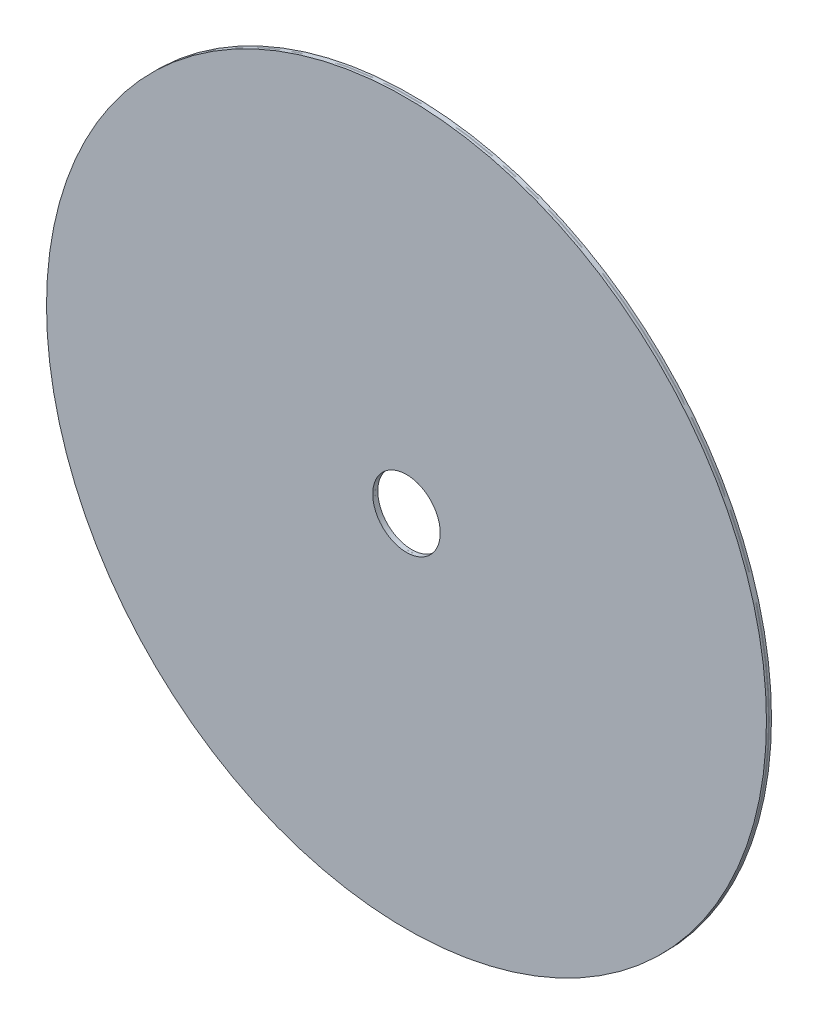
ISO-10303-21;
HEADER;
FILE_DESCRIPTION(('STEP AP214'),'2;1');
FILE_NAME('part.step','',(''),(''),'','','');
FILE_SCHEMA(('AUTOMOTIVE_DESIGN { 1 0 10303 214 1 1 1 1 }'));
ENDSEC;
DATA;
#1=APPLICATION_CONTEXT('core data for automotive mechanical design processes');
#2=APPLICATION_PROTOCOL_DEFINITION('international standard','automotive_design',2000,#1);
#3=PRODUCT_CONTEXT('',#1,'mechanical');
#4=PRODUCT('Part','Part','',(#3));
#5=PRODUCT_RELATED_PRODUCT_CATEGORY('part','',(#4));
#6=PRODUCT_DEFINITION_FORMATION('','',#4);
#7=PRODUCT_DEFINITION_CONTEXT('part definition',#1,'design');
#8=PRODUCT_DEFINITION('design','',#6,#7);
#9=PRODUCT_DEFINITION_SHAPE('','',#8);
#10=(LENGTH_UNIT() NAMED_UNIT(*) SI_UNIT(.MILLI.,.METRE.));
#11=(NAMED_UNIT(*) PLANE_ANGLE_UNIT() SI_UNIT($,.RADIAN.));
#12=(NAMED_UNIT(*) SI_UNIT($,.STERADIAN.) SOLID_ANGLE_UNIT());
#13=UNCERTAINTY_MEASURE_WITH_UNIT(LENGTH_MEASURE(1.E-05),#10,'distance_accuracy_value','');
#14=(GEOMETRIC_REPRESENTATION_CONTEXT(3) GLOBAL_UNCERTAINTY_ASSIGNED_CONTEXT((#13)) GLOBAL_UNIT_ASSIGNED_CONTEXT((#10,
#11,#12)) REPRESENTATION_CONTEXT('',''));
#15=CARTESIAN_POINT('',(0.,0.,0.));
#16=DIRECTION('',(0.,0.,1.));
#17=DIRECTION('',(1.,0.,0.));
#18=AXIS2_PLACEMENT_3D('',#15,#16,#17);
#19=CARTESIAN_POINT('',(0.,0.,0.0127));
#20=DIRECTION('',(0.,0.,-1.));
#21=DIRECTION('',(-1.,0.,0.));
#22=AXIS2_PLACEMENT_3D('',#19,#20,#21);
#23=CYLINDRICAL_SURFACE('',#22,1.190625);
#24=CARTESIAN_POINT('',(0.,0.,-0.0127));
#25=DIRECTION('',(0.,0.,1.));
#26=DIRECTION('',(1.,0.,0.));
#27=AXIS2_PLACEMENT_3D('',#24,#25,#26);
#28=CIRCLE('',#27,1.190625);
#29=CARTESIAN_POINT('',(1.17770059824204,-0.174954827099316,-0.0127));
#30=VERTEX_POINT('',#29);
#31=CARTESIAN_POINT('',(1.17802245917716,0.172774350814024,-0.0127));
#32=VERTEX_POINT('',#31);
#33=EDGE_CURVE('E236',#30,#32,#28,.T.);
#34=ORIENTED_EDGE('',*,*,#33,.F.);
#35=DIRECTION('',(0.,0.,-1.));
#36=VECTOR('',#35,1.);
#37=CARTESIAN_POINT('',(1.17770059824204,-0.174954827099316,0.0127));
#38=LINE('',#37,#36);
#39=CARTESIAN_POINT('',(1.17770059824204,-0.174954827099316,0.0127));
#40=VERTEX_POINT('',#39);
#41=EDGE_CURVE('E13',#40,#30,#38,.T.);
#42=ORIENTED_EDGE('',*,*,#41,.F.);
#43=CARTESIAN_POINT('',(0.,0.,0.0127));
#44=DIRECTION('',(0.,0.,1.));
#45=DIRECTION('',(1.,0.,0.));
#46=AXIS2_PLACEMENT_3D('',#43,#44,#45);
#47=CIRCLE('',#46,1.190625);
#48=CARTESIAN_POINT('',(1.17802245917716,0.172774350814024,0.0127));
#49=VERTEX_POINT('',#48);
#50=EDGE_CURVE('E228',#40,#49,#47,.T.);
#51=ORIENTED_EDGE('',*,*,#50,.T.);
#52=DIRECTION('',(0.,0.,-1.));
#53=VECTOR('',#52,1.);
#54=CARTESIAN_POINT('',(1.17802245917716,0.172774350814024,0.0127));
#55=LINE('',#54,#53);
#56=EDGE_CURVE('E189',#49,#32,#55,.T.);
#57=ORIENTED_EDGE('',*,*,#56,.T.);
#58=EDGE_LOOP('',(#34,#42,#51,#57));
#59=FACE_BOUND('',#58,.T.);
#60=ADVANCED_FACE('F173',(#59),#23,.F.);
#61=CARTESIAN_POINT('',(0.,-0.174954827099316,0.0127));
#62=DIRECTION('',(0.,-1.,0.));
#63=DIRECTION('',(1.,0.,0.));
#64=AXIS2_PLACEMENT_3D('',#61,#62,#63);
#65=PLANE('',#64);
#66=DIRECTION('',(-1.,0.,0.));
#67=VECTOR('',#66,1.);
#68=CARTESIAN_POINT('',(0.,-0.174954827099316,-0.0127));
#69=LINE('',#68,#67);
#70=CARTESIAN_POINT('',(3.69269610432094,-0.174954827099315,-0.0127));
#71=VERTEX_POINT('',#70);
#72=EDGE_CURVE('E219',#71,#30,#69,.T.);
#73=ORIENTED_EDGE('',*,*,#72,.F.);
#74=DIRECTION('',(0.,0.,-1.));
#75=VECTOR('',#74,1.);
#76=CARTESIAN_POINT('',(3.69269610432094,-0.174954827099315,0.0127));
#77=LINE('',#76,#75);
#78=CARTESIAN_POINT('',(3.69269610432094,-0.174954827099315,0.0127));
#79=VERTEX_POINT('',#78);
#80=EDGE_CURVE('E181',#79,#71,#77,.T.);
#81=ORIENTED_EDGE('',*,*,#80,.F.);
#82=DIRECTION('',(-1.,0.,0.));
#83=VECTOR('',#82,1.);
#84=CARTESIAN_POINT('',(0.,-0.174954827099316,0.0127));
#85=LINE('',#84,#83);
#86=EDGE_CURVE('E217',#79,#40,#85,.T.);
#87=ORIENTED_EDGE('',*,*,#86,.T.);
#88=ORIENTED_EDGE('',*,*,#41,.T.);
#89=EDGE_LOOP('',(#73,#81,#87,#88));
#90=FACE_BOUND('',#89,.T.);
#91=ADVANCED_FACE('F216',(#90),#65,.T.);
#92=CARTESIAN_POINT('',(3.69269610432094,0.,0.0127));
#93=DIRECTION('',(1.,0.,0.));
#94=DIRECTION('',(0.,0.,-1.));
#95=AXIS2_PLACEMENT_3D('',#92,#93,#94);
#96=PLANE('',#95);
#97=DIRECTION('',(0.,-1.,0.));
#98=VECTOR('',#97,1.);
#99=CARTESIAN_POINT('',(3.69269610432094,0.,-0.0127));
#100=LINE('',#99,#98);
#101=CARTESIAN_POINT('',(3.69269610432094,0.172774350814025,-0.0127));
#102=VERTEX_POINT('',#101);
#103=EDGE_CURVE('E239',#102,#71,#100,.T.);
#104=ORIENTED_EDGE('',*,*,#103,.F.);
#105=DIRECTION('',(0.,0.,-1.));
#106=VECTOR('',#105,1.);
#107=CARTESIAN_POINT('',(3.69269610432094,0.172774350814025,0.0127));
#108=LINE('',#107,#106);
#109=CARTESIAN_POINT('',(3.69269610432094,0.172774350814025,0.0127));
#110=VERTEX_POINT('',#109);
#111=EDGE_CURVE('E202',#110,#102,#108,.T.);
#112=ORIENTED_EDGE('',*,*,#111,.F.);
#113=DIRECTION('',(0.,-1.,0.));
#114=VECTOR('',#113,1.);
#115=CARTESIAN_POINT('',(3.69269610432094,0.,0.0127));
#116=LINE('',#115,#114);
#117=EDGE_CURVE('E227',#110,#79,#116,.T.);
#118=ORIENTED_EDGE('',*,*,#117,.T.);
#119=ORIENTED_EDGE('',*,*,#80,.T.);
#120=EDGE_LOOP('',(#104,#112,#118,#119));
#121=FACE_BOUND('',#120,.T.);
#122=ADVANCED_FACE('F230',(#121),#96,.T.);
#123=CARTESIAN_POINT('',(0.,0.172774350814024,0.0127));
#124=DIRECTION('',(0.,1.,0.));
#125=DIRECTION('',(-1.,0.,0.));
#126=AXIS2_PLACEMENT_3D('',#123,#124,#125);
#127=PLANE('',#126);
#128=DIRECTION('',(1.,0.,0.));
#129=VECTOR('',#128,1.);
#130=CARTESIAN_POINT('',(0.,0.172774350814024,-0.0127));
#131=LINE('',#130,#129);
#132=EDGE_CURVE('E241',#32,#102,#131,.T.);
#133=ORIENTED_EDGE('',*,*,#132,.F.);
#134=ORIENTED_EDGE('',*,*,#56,.F.);
#135=DIRECTION('',(1.,0.,0.));
#136=VECTOR('',#135,1.);
#137=CARTESIAN_POINT('',(0.,0.172774350814024,0.0127));
#138=LINE('',#137,#136);
#139=EDGE_CURVE('E231',#49,#110,#138,.T.);
#140=ORIENTED_EDGE('',*,*,#139,.T.);
#141=ORIENTED_EDGE('',*,*,#111,.T.);
#142=EDGE_LOOP('',(#133,#134,#140,#141));
#143=FACE_BOUND('',#142,.T.);
#144=ADVANCED_FACE('F246',(#143),#127,.T.);
#145=CARTESIAN_POINT('',(0.,0.,0.0127));
#146=DIRECTION('',(0.,0.,1.));
#147=DIRECTION('',(1.,0.,0.));
#148=AXIS2_PLACEMENT_3D('',#145,#146,#147);
#149=PLANE('',#148);
#150=ORIENTED_EDGE('',*,*,#50,.F.);
#151=ORIENTED_EDGE('',*,*,#86,.F.);
#152=ORIENTED_EDGE('',*,*,#117,.F.);
#153=ORIENTED_EDGE('',*,*,#139,.F.);
#154=EDGE_LOOP('',(#150,#151,#152,#153));
#155=FACE_BOUND('',#154,.T.);
#156=ADVANCED_FACE('F225',(#155),#149,.T.);
#157=CARTESIAN_POINT('',(0.,0.,-0.0127));
#158=DIRECTION('',(0.,0.,1.));
#159=DIRECTION('',(1.,0.,0.));
#160=AXIS2_PLACEMENT_3D('',#157,#158,#159);
#161=PLANE('',#160);
#162=ORIENTED_EDGE('',*,*,#33,.T.);
#163=ORIENTED_EDGE('',*,*,#132,.T.);
#164=ORIENTED_EDGE('',*,*,#103,.T.);
#165=ORIENTED_EDGE('',*,*,#72,.T.);
#166=EDGE_LOOP('',(#162,#163,#164,#165));
#167=FACE_BOUND('',#166,.T.);
#168=ADVANCED_FACE('F253',(#167),#161,.F.);
#169=CLOSED_SHELL('',(#60,#91,#122,#144,#156,#168));
#170=MANIFOLD_SOLID_BREP('B2',#169);
#171=CARTESIAN_POINT('',(0.,0.,0.0127));
#172=DIRECTION('',(0.,0.,-1.));
#173=DIRECTION('',(-1.,0.,0.));
#174=AXIS2_PLACEMENT_3D('',#171,#172,#173);
#175=CYLINDRICAL_SURFACE('',#174,1.190625);
#176=CARTESIAN_POINT('',(0.,0.,-0.0127));
#177=DIRECTION('',(0.,0.,1.));
#178=DIRECTION('',(1.,0.,0.));
#179=AXIS2_PLACEMENT_3D('',#176,#177,#178);
#180=CIRCLE('',#179,1.190625);
#181=CARTESIAN_POINT('',(-0.176045065241965,-1.17753812066912,-0.0127));
#182=VERTEX_POINT('',#181);
#183=CARTESIAN_POINT('',(0.171684112671375,-1.17818184338465,-0.0127));
#184=VERTEX_POINT('',#183);
#185=EDGE_CURVE('E369',#182,#184,#180,.T.);
#186=ORIENTED_EDGE('',*,*,#185,.F.);
#187=DIRECTION('',(0.,0.,-1.));
#188=VECTOR('',#187,1.);
#189=CARTESIAN_POINT('',(-0.176045065241965,-1.17753812066912,0.0127));
#190=LINE('',#189,#188);
#191=CARTESIAN_POINT('',(-0.176045065241965,-1.17753812066912,0.0127));
#192=VERTEX_POINT('',#191);
#193=EDGE_CURVE('E171',#192,#182,#190,.T.);
#194=ORIENTED_EDGE('',*,*,#193,.F.);
#195=CARTESIAN_POINT('',(0.,0.,0.0127));
#196=DIRECTION('',(0.,0.,1.));
#197=DIRECTION('',(1.,0.,0.));
#198=AXIS2_PLACEMENT_3D('',#195,#196,#197);
#199=CIRCLE('',#198,1.190625);
#200=CARTESIAN_POINT('',(0.171684112671375,-1.17818184338465,0.0127));
#201=VERTEX_POINT('',#200);
#202=EDGE_CURVE('E361',#192,#201,#199,.T.);
#203=ORIENTED_EDGE('',*,*,#202,.T.);
#204=DIRECTION('',(0.,0.,-1.));
#205=VECTOR('',#204,1.);
#206=CARTESIAN_POINT('',(0.171684112671375,-1.17818184338465,0.0127));
#207=LINE('',#206,#205);
#208=EDGE_CURVE('E322',#201,#184,#207,.T.);
#209=ORIENTED_EDGE('',*,*,#208,.T.);
#210=EDGE_LOOP('',(#186,#194,#203,#209));
#211=FACE_BOUND('',#210,.T.);
#212=ADVANCED_FACE('F306',(#211),#175,.F.);
#213=CARTESIAN_POINT('',(-0.176045065241965,0.,0.0127));
#214=DIRECTION('',(-1.,0.,0.));
#215=DIRECTION('',(0.,-1.,0.));
#216=AXIS2_PLACEMENT_3D('',#213,#214,#215);
#217=PLANE('',#216);
#218=DIRECTION('',(0.,1.,0.));
#219=VECTOR('',#218,1.);
#220=CARTESIAN_POINT('',(-0.176045065241965,0.,-0.0127));
#221=LINE('',#220,#219);
#222=CARTESIAN_POINT('',(-0.176045065241965,-3.69378634246359,-0.0127));
#223=VERTEX_POINT('',#222);
#224=EDGE_CURVE('E352',#223,#182,#221,.T.);
#225=ORIENTED_EDGE('',*,*,#224,.F.);
#226=DIRECTION('',(0.,0.,-1.));
#227=VECTOR('',#226,1.);
#228=CARTESIAN_POINT('',(-0.176045065241965,-3.69378634246359,0.0127));
#229=LINE('',#228,#227);
#230=CARTESIAN_POINT('',(-0.176045065241965,-3.69378634246359,0.0127));
#231=VERTEX_POINT('',#230);
#232=EDGE_CURVE('E314',#231,#223,#229,.T.);
#233=ORIENTED_EDGE('',*,*,#232,.F.);
#234=DIRECTION('',(0.,1.,0.));
#235=VECTOR('',#234,1.);
#236=CARTESIAN_POINT('',(-0.176045065241965,0.,0.0127));
#237=LINE('',#236,#235);
#238=EDGE_CURVE('E350',#231,#192,#237,.T.);
#239=ORIENTED_EDGE('',*,*,#238,.T.);
#240=ORIENTED_EDGE('',*,*,#193,.T.);
#241=EDGE_LOOP('',(#225,#233,#239,#240));
#242=FACE_BOUND('',#241,.T.);
#243=ADVANCED_FACE('F349',(#242),#217,.T.);
#244=CARTESIAN_POINT('',(0.,-3.69378634246359,0.0127));
#245=DIRECTION('',(0.,-1.,0.));
#246=DIRECTION('',(0.,0.,-1.));
#247=AXIS2_PLACEMENT_3D('',#244,#245,#246);
#248=PLANE('',#247);
#249=DIRECTION('',(-1.,0.,0.));
#250=VECTOR('',#249,1.);
#251=CARTESIAN_POINT('',(0.,-3.69378634246359,-0.0127));
#252=LINE('',#251,#250);
#253=CARTESIAN_POINT('',(0.171684112671376,-3.69378634246359,-0.0127));
#254=VERTEX_POINT('',#253);
#255=EDGE_CURVE('E372',#254,#223,#252,.T.);
#256=ORIENTED_EDGE('',*,*,#255,.F.);
#257=DIRECTION('',(0.,0.,-1.));
#258=VECTOR('',#257,1.);
#259=CARTESIAN_POINT('',(0.171684112671376,-3.69378634246359,0.0127));
#260=LINE('',#259,#258);
#261=CARTESIAN_POINT('',(0.171684112671376,-3.69378634246359,0.0127));
#262=VERTEX_POINT('',#261);
#263=EDGE_CURVE('E335',#262,#254,#260,.T.);
#264=ORIENTED_EDGE('',*,*,#263,.F.);
#265=DIRECTION('',(-1.,0.,0.));
#266=VECTOR('',#265,1.);
#267=CARTESIAN_POINT('',(0.,-3.69378634246359,0.0127));
#268=LINE('',#267,#266);
#269=EDGE_CURVE('E360',#262,#231,#268,.T.);
#270=ORIENTED_EDGE('',*,*,#269,.T.);
#271=ORIENTED_EDGE('',*,*,#232,.T.);
#272=EDGE_LOOP('',(#256,#264,#270,#271));
#273=FACE_BOUND('',#272,.T.);
#274=ADVANCED_FACE('F363',(#273),#248,.T.);
#275=CARTESIAN_POINT('',(0.171684112671374,0.,0.0127));
#276=DIRECTION('',(1.,0.,0.));
#277=DIRECTION('',(0.,1.,0.));
#278=AXIS2_PLACEMENT_3D('',#275,#276,#277);
#279=PLANE('',#278);
#280=DIRECTION('',(0.,-1.,0.));
#281=VECTOR('',#280,1.);
#282=CARTESIAN_POINT('',(0.171684112671374,0.,-0.0127));
#283=LINE('',#282,#281);
#284=EDGE_CURVE('E374',#184,#254,#283,.T.);
#285=ORIENTED_EDGE('',*,*,#284,.F.);
#286=ORIENTED_EDGE('',*,*,#208,.F.);
#287=DIRECTION('',(0.,-1.,0.));
#288=VECTOR('',#287,1.);
#289=CARTESIAN_POINT('',(0.171684112671374,0.,0.0127));
#290=LINE('',#289,#288);
#291=EDGE_CURVE('E364',#201,#262,#290,.T.);
#292=ORIENTED_EDGE('',*,*,#291,.T.);
#293=ORIENTED_EDGE('',*,*,#263,.T.);
#294=EDGE_LOOP('',(#285,#286,#292,#293));
#295=FACE_BOUND('',#294,.T.);
#296=ADVANCED_FACE('F379',(#295),#279,.T.);
#297=CARTESIAN_POINT('',(0.,0.,0.0127));
#298=DIRECTION('',(0.,0.,1.));
#299=DIRECTION('',(1.,0.,0.));
#300=AXIS2_PLACEMENT_3D('',#297,#298,#299);
#301=PLANE('',#300);
#302=ORIENTED_EDGE('',*,*,#202,.F.);
#303=ORIENTED_EDGE('',*,*,#238,.F.);
#304=ORIENTED_EDGE('',*,*,#269,.F.);
#305=ORIENTED_EDGE('',*,*,#291,.F.);
#306=EDGE_LOOP('',(#302,#303,#304,#305));
#307=FACE_BOUND('',#306,.T.);
#308=ADVANCED_FACE('F358',(#307),#301,.T.);
#309=CARTESIAN_POINT('',(0.,0.,-0.0127));
#310=DIRECTION('',(0.,0.,1.));
#311=DIRECTION('',(1.,0.,0.));
#312=AXIS2_PLACEMENT_3D('',#309,#310,#311);
#313=PLANE('',#312);
#314=ORIENTED_EDGE('',*,*,#185,.T.);
#315=ORIENTED_EDGE('',*,*,#284,.T.);
#316=ORIENTED_EDGE('',*,*,#255,.T.);
#317=ORIENTED_EDGE('',*,*,#224,.T.);
#318=EDGE_LOOP('',(#314,#315,#316,#317));
#319=FACE_BOUND('',#318,.T.);
#320=ADVANCED_FACE('F386',(#319),#313,.F.);
#321=CLOSED_SHELL('',(#212,#243,#274,#296,#308,#320));
#322=MANIFOLD_SOLID_BREP('B7',#321);
#323=CARTESIAN_POINT('',(0.,3.69378634246359,0.0127));
#324=DIRECTION('',(0.,1.,0.));
#325=DIRECTION('',(0.,0.,1.));
#326=AXIS2_PLACEMENT_3D('',#323,#324,#325);
#327=PLANE('',#326);
#328=DIRECTION('',(1.,0.,0.));
#329=VECTOR('',#328,1.);
#330=CARTESIAN_POINT('',(0.,3.69378634246359,-0.0127));
#331=LINE('',#330,#329);
#332=CARTESIAN_POINT('',(-0.17386458895667,3.69378634246359,-0.0127));
#333=VERTEX_POINT('',#332);
#334=CARTESIAN_POINT('',(0.17386458895667,3.69378634246359,-0.0127));
#335=VERTEX_POINT('',#334);
#336=EDGE_CURVE('E502',#333,#335,#331,.T.);
#337=ORIENTED_EDGE('',*,*,#336,.F.);
#338=DIRECTION('',(0.,0.,-1.));
#339=VECTOR('',#338,1.);
#340=CARTESIAN_POINT('',(-0.17386458895667,3.69378634246359,0.0127));
#341=LINE('',#340,#339);
#342=CARTESIAN_POINT('',(-0.17386458895667,3.69378634246359,0.0127));
#343=VERTEX_POINT('',#342);
#344=EDGE_CURVE('E304',#343,#333,#341,.T.);
#345=ORIENTED_EDGE('',*,*,#344,.F.);
#346=DIRECTION('',(1.,0.,0.));
#347=VECTOR('',#346,1.);
#348=CARTESIAN_POINT('',(0.,3.69378634246359,0.0127));
#349=LINE('',#348,#347);
#350=CARTESIAN_POINT('',(0.17386458895667,3.69378634246359,0.0127));
#351=VERTEX_POINT('',#350);
#352=EDGE_CURVE('E494',#343,#351,#349,.T.);
#353=ORIENTED_EDGE('',*,*,#352,.T.);
#354=DIRECTION('',(0.,0.,-1.));
#355=VECTOR('',#354,1.);
#356=CARTESIAN_POINT('',(0.17386458895667,3.69378634246359,0.0127));
#357=LINE('',#356,#355);
#358=EDGE_CURVE('E455',#351,#335,#357,.T.);
#359=ORIENTED_EDGE('',*,*,#358,.T.);
#360=EDGE_LOOP('',(#337,#345,#353,#359));
#361=FACE_BOUND('',#360,.T.);
#362=ADVANCED_FACE('F439',(#361),#327,.T.);
#363=CARTESIAN_POINT('',(-0.173864588956669,0.,0.0127));
#364=DIRECTION('',(-1.,0.,0.));
#365=DIRECTION('',(0.,-1.,0.));
#366=AXIS2_PLACEMENT_3D('',#363,#364,#365);
#367=PLANE('',#366);
#368=DIRECTION('',(0.,1.,0.));
#369=VECTOR('',#368,1.);
#370=CARTESIAN_POINT('',(-0.173864588956669,0.,-0.0127));
#371=LINE('',#370,#369);
#372=CARTESIAN_POINT('',(-0.173864588956669,1.17786204427001,-0.0127));
#373=VERTEX_POINT('',#372);
#374=EDGE_CURVE('E485',#373,#333,#371,.T.);
#375=ORIENTED_EDGE('',*,*,#374,.F.);
#376=DIRECTION('',(0.,0.,-1.));
#377=VECTOR('',#376,1.);
#378=CARTESIAN_POINT('',(-0.173864588956669,1.17786204427001,0.0127));
#379=LINE('',#378,#377);
#380=CARTESIAN_POINT('',(-0.173864588956669,1.17786204427001,0.0127));
#381=VERTEX_POINT('',#380);
#382=EDGE_CURVE('E447',#381,#373,#379,.T.);
#383=ORIENTED_EDGE('',*,*,#382,.F.);
#384=DIRECTION('',(0.,1.,0.));
#385=VECTOR('',#384,1.);
#386=CARTESIAN_POINT('',(-0.173864588956669,0.,0.0127));
#387=LINE('',#386,#385);
#388=EDGE_CURVE('E483',#381,#343,#387,.T.);
#389=ORIENTED_EDGE('',*,*,#388,.T.);
#390=ORIENTED_EDGE('',*,*,#344,.T.);
#391=EDGE_LOOP('',(#375,#383,#389,#390));
#392=FACE_BOUND('',#391,.T.);
#393=ADVANCED_FACE('F482',(#392),#367,.T.);
#394=CARTESIAN_POINT('',(0.,0.,0.0127));
#395=DIRECTION('',(0.,0.,-1.));
#396=DIRECTION('',(-1.,0.,0.));
#397=AXIS2_PLACEMENT_3D('',#394,#395,#396);
#398=CYLINDRICAL_SURFACE('',#397,1.190625);
#399=CARTESIAN_POINT('',(0.,0.,-0.0127));
#400=DIRECTION('',(0.,0.,1.));
#401=DIRECTION('',(1.,0.,0.));
#402=AXIS2_PLACEMENT_3D('',#399,#400,#401);
#403=CIRCLE('',#402,1.190625);
#404=CARTESIAN_POINT('',(0.17386458895667,1.17786204427001,-0.0127));
#405=VERTEX_POINT('',#404);
#406=EDGE_CURVE('E505',#405,#373,#403,.T.);
#407=ORIENTED_EDGE('',*,*,#406,.F.);
#408=DIRECTION('',(0.,0.,-1.));
#409=VECTOR('',#408,1.);
#410=CARTESIAN_POINT('',(0.17386458895667,1.17786204427001,0.0127));
#411=LINE('',#410,#409);
#412=CARTESIAN_POINT('',(0.17386458895667,1.17786204427001,0.0127));
#413=VERTEX_POINT('',#412);
#414=EDGE_CURVE('E468',#413,#405,#411,.T.);
#415=ORIENTED_EDGE('',*,*,#414,.F.);
#416=CARTESIAN_POINT('',(0.,0.,0.0127));
#417=DIRECTION('',(0.,0.,1.));
#418=DIRECTION('',(1.,0.,0.));
#419=AXIS2_PLACEMENT_3D('',#416,#417,#418);
#420=CIRCLE('',#419,1.190625);
#421=EDGE_CURVE('E493',#413,#381,#420,.T.);
#422=ORIENTED_EDGE('',*,*,#421,.T.);
#423=ORIENTED_EDGE('',*,*,#382,.T.);
#424=EDGE_LOOP('',(#407,#415,#422,#423));
#425=FACE_BOUND('',#424,.T.);
#426=ADVANCED_FACE('F496',(#425),#398,.F.);
#427=CARTESIAN_POINT('',(0.173864588956671,0.,0.0127));
#428=DIRECTION('',(1.,0.,0.));
#429=DIRECTION('',(0.,1.,0.));
#430=AXIS2_PLACEMENT_3D('',#427,#428,#429);
#431=PLANE('',#430);
#432=DIRECTION('',(0.,-1.,0.));
#433=VECTOR('',#432,1.);
#434=CARTESIAN_POINT('',(0.173864588956671,0.,-0.0127));
#435=LINE('',#434,#433);
#436=EDGE_CURVE('E507',#335,#405,#435,.T.);
#437=ORIENTED_EDGE('',*,*,#436,.F.);
#438=ORIENTED_EDGE('',*,*,#358,.F.);
#439=DIRECTION('',(0.,-1.,0.));
#440=VECTOR('',#439,1.);
#441=CARTESIAN_POINT('',(0.173864588956671,0.,0.0127));
#442=LINE('',#441,#440);
#443=EDGE_CURVE('E497',#351,#413,#442,.T.);
#444=ORIENTED_EDGE('',*,*,#443,.T.);
#445=ORIENTED_EDGE('',*,*,#414,.T.);
#446=EDGE_LOOP('',(#437,#438,#444,#445));
#447=FACE_BOUND('',#446,.T.);
#448=ADVANCED_FACE('F512',(#447),#431,.T.);
#449=CARTESIAN_POINT('',(0.,0.,0.0127));
#450=DIRECTION('',(0.,0.,1.));
#451=DIRECTION('',(1.,0.,0.));
#452=AXIS2_PLACEMENT_3D('',#449,#450,#451);
#453=PLANE('',#452);
#454=ORIENTED_EDGE('',*,*,#352,.F.);
#455=ORIENTED_EDGE('',*,*,#388,.F.);
#456=ORIENTED_EDGE('',*,*,#421,.F.);
#457=ORIENTED_EDGE('',*,*,#443,.F.);
#458=EDGE_LOOP('',(#454,#455,#456,#457));
#459=FACE_BOUND('',#458,.T.);
#460=ADVANCED_FACE('F491',(#459),#453,.T.);
#461=CARTESIAN_POINT('',(0.,0.,-0.0127));
#462=DIRECTION('',(0.,0.,1.));
#463=DIRECTION('',(1.,0.,0.));
#464=AXIS2_PLACEMENT_3D('',#461,#462,#463);
#465=PLANE('',#464);
#466=ORIENTED_EDGE('',*,*,#336,.T.);
#467=ORIENTED_EDGE('',*,*,#436,.T.);
#468=ORIENTED_EDGE('',*,*,#406,.T.);
#469=ORIENTED_EDGE('',*,*,#374,.T.);
#470=EDGE_LOOP('',(#466,#467,#468,#469));
#471=FACE_BOUND('',#470,.T.);
#472=ADVANCED_FACE('F519',(#471),#465,.F.);
#473=CLOSED_SHELL('',(#362,#393,#426,#448,#460,#472));
#474=MANIFOLD_SOLID_BREP('B165',#473);
#475=CARTESIAN_POINT('',(0.,0.,0.0127));
#476=DIRECTION('',(0.,0.,-1.));
#477=DIRECTION('',(-1.,0.,0.));
#478=AXIS2_PLACEMENT_3D('',#475,#476,#477);
#479=CYLINDRICAL_SURFACE('',#478,1.190625);
#480=CARTESIAN_POINT('',(0.,0.,-0.0127));
#481=DIRECTION('',(0.,0.,1.));
#482=DIRECTION('',(1.,0.,0.));
#483=AXIS2_PLACEMENT_3D('',#480,#481,#482);
#484=CIRCLE('',#483,1.190625);
#485=CARTESIAN_POINT('',(-1.17770059824203,0.17495482709932,-0.0127));
#486=VERTEX_POINT('',#485);
#487=CARTESIAN_POINT('',(-1.17802245917716,-0.17277435081402,-0.0127));
#488=VERTEX_POINT('',#487);
#489=EDGE_CURVE('E639',#486,#488,#484,.T.);
#490=ORIENTED_EDGE('',*,*,#489,.F.);
#491=DIRECTION('',(0.,0.,-1.));
#492=VECTOR('',#491,1.);
#493=CARTESIAN_POINT('',(-1.17770059824203,0.17495482709932,0.0127));
#494=LINE('',#493,#492);
#495=CARTESIAN_POINT('',(-1.17770059824203,0.17495482709932,0.0127));
#496=VERTEX_POINT('',#495);
#497=EDGE_CURVE('E437',#496,#486,#494,.T.);
#498=ORIENTED_EDGE('',*,*,#497,.F.);
#499=CARTESIAN_POINT('',(0.,0.,0.0127));
#500=DIRECTION('',(0.,0.,1.));
#501=DIRECTION('',(1.,0.,0.));
#502=AXIS2_PLACEMENT_3D('',#499,#500,#501);
#503=CIRCLE('',#502,1.190625);
#504=CARTESIAN_POINT('',(-1.17802245917716,-0.17277435081402,0.0127));
#505=VERTEX_POINT('',#504);
#506=EDGE_CURVE('E631',#496,#505,#503,.T.);
#507=ORIENTED_EDGE('',*,*,#506,.T.);
#508=DIRECTION('',(0.,0.,-1.));
#509=VECTOR('',#508,1.);
#510=CARTESIAN_POINT('',(-1.17802245917716,-0.17277435081402,0.0127));
#511=LINE('',#510,#509);
#512=EDGE_CURVE('E592',#505,#488,#511,.T.);
#513=ORIENTED_EDGE('',*,*,#512,.T.);
#514=EDGE_LOOP('',(#490,#498,#507,#513));
#515=FACE_BOUND('',#514,.T.);
#516=ADVANCED_FACE('F576',(#515),#479,.F.);
#517=CARTESIAN_POINT('',(0.,0.17495482709932,0.0127));
#518=DIRECTION('',(0.,1.,0.));
#519=DIRECTION('',(-1.,0.,0.));
#520=AXIS2_PLACEMENT_3D('',#517,#518,#519);
#521=PLANE('',#520);
#522=DIRECTION('',(1.,0.,0.));
#523=VECTOR('',#522,1.);
#524=CARTESIAN_POINT('',(0.,0.17495482709932,-0.0127));
#525=LINE('',#524,#523);
#526=CARTESIAN_POINT('',(-3.69487658060624,0.174954827099319,-0.0127));
#527=VERTEX_POINT('',#526);
#528=EDGE_CURVE('E622',#527,#486,#525,.T.);
#529=ORIENTED_EDGE('',*,*,#528,.F.);
#530=DIRECTION('',(0.,0.,-1.));
#531=VECTOR('',#530,1.);
#532=CARTESIAN_POINT('',(-3.69487658060624,0.174954827099319,0.0127));
#533=LINE('',#532,#531);
#534=CARTESIAN_POINT('',(-3.69487658060624,0.174954827099319,0.0127));
#535=VERTEX_POINT('',#534);
#536=EDGE_CURVE('E584',#535,#527,#533,.T.);
#537=ORIENTED_EDGE('',*,*,#536,.F.);
#538=DIRECTION('',(1.,0.,0.));
#539=VECTOR('',#538,1.);
#540=CARTESIAN_POINT('',(0.,0.17495482709932,0.0127));
#541=LINE('',#540,#539);
#542=EDGE_CURVE('E620',#535,#496,#541,.T.);
#543=ORIENTED_EDGE('',*,*,#542,.T.);
#544=ORIENTED_EDGE('',*,*,#497,.T.);
#545=EDGE_LOOP('',(#529,#537,#543,#544));
#546=FACE_BOUND('',#545,.T.);
#547=ADVANCED_FACE('F619',(#546),#521,.T.);
#548=CARTESIAN_POINT('',(-3.69487658060624,0.,0.0127));
#549=DIRECTION('',(-1.,0.,0.));
#550=DIRECTION('',(0.,0.,1.));
#551=AXIS2_PLACEMENT_3D('',#548,#549,#550);
#552=PLANE('',#551);
#553=DIRECTION('',(0.,1.,0.));
#554=VECTOR('',#553,1.);
#555=CARTESIAN_POINT('',(-3.69487658060624,0.,-0.0127));
#556=LINE('',#555,#554);
#557=CARTESIAN_POINT('',(-3.69487658060624,-0.172774350814021,-0.0127));
#558=VERTEX_POINT('',#557);
#559=EDGE_CURVE('E642',#558,#527,#556,.T.);
#560=ORIENTED_EDGE('',*,*,#559,.F.);
#561=DIRECTION('',(0.,0.,-1.));
#562=VECTOR('',#561,1.);
#563=CARTESIAN_POINT('',(-3.69487658060624,-0.172774350814021,0.0127));
#564=LINE('',#563,#562);
#565=CARTESIAN_POINT('',(-3.69487658060624,-0.172774350814021,0.0127));
#566=VERTEX_POINT('',#565);
#567=EDGE_CURVE('E605',#566,#558,#564,.T.);
#568=ORIENTED_EDGE('',*,*,#567,.F.);
#569=DIRECTION('',(0.,1.,0.));
#570=VECTOR('',#569,1.);
#571=CARTESIAN_POINT('',(-3.69487658060624,0.,0.0127));
#572=LINE('',#571,#570);
#573=EDGE_CURVE('E630',#566,#535,#572,.T.);
#574=ORIENTED_EDGE('',*,*,#573,.T.);
#575=ORIENTED_EDGE('',*,*,#536,.T.);
#576=EDGE_LOOP('',(#560,#568,#574,#575));
#577=FACE_BOUND('',#576,.T.);
#578=ADVANCED_FACE('F633',(#577),#552,.T.);
#579=CARTESIAN_POINT('',(0.,-0.17277435081402,0.0127));
#580=DIRECTION('',(0.,-1.,0.));
#581=DIRECTION('',(1.,0.,0.));
#582=AXIS2_PLACEMENT_3D('',#579,#580,#581);
#583=PLANE('',#582);
#584=DIRECTION('',(-1.,0.,0.));
#585=VECTOR('',#584,1.);
#586=CARTESIAN_POINT('',(0.,-0.17277435081402,-0.0127));
#587=LINE('',#586,#585);
#588=EDGE_CURVE('E644',#488,#558,#587,.T.);
#589=ORIENTED_EDGE('',*,*,#588,.F.);
#590=ORIENTED_EDGE('',*,*,#512,.F.);
#591=DIRECTION('',(-1.,0.,0.));
#592=VECTOR('',#591,1.);
#593=CARTESIAN_POINT('',(0.,-0.17277435081402,0.0127));
#594=LINE('',#593,#592);
#595=EDGE_CURVE('E634',#505,#566,#594,.T.);
#596=ORIENTED_EDGE('',*,*,#595,.T.);
#597=ORIENTED_EDGE('',*,*,#567,.T.);
#598=EDGE_LOOP('',(#589,#590,#596,#597));
#599=FACE_BOUND('',#598,.T.);
#600=ADVANCED_FACE('F649',(#599),#583,.T.);
#601=CARTESIAN_POINT('',(0.,0.,0.0127));
#602=DIRECTION('',(0.,0.,1.));
#603=DIRECTION('',(1.,0.,0.));
#604=AXIS2_PLACEMENT_3D('',#601,#602,#603);
#605=PLANE('',#604);
#606=ORIENTED_EDGE('',*,*,#506,.F.);
#607=ORIENTED_EDGE('',*,*,#542,.F.);
#608=ORIENTED_EDGE('',*,*,#573,.F.);
#609=ORIENTED_EDGE('',*,*,#595,.F.);
#610=EDGE_LOOP('',(#606,#607,#608,#609));
#611=FACE_BOUND('',#610,.T.);
#612=ADVANCED_FACE('F628',(#611),#605,.T.);
#613=CARTESIAN_POINT('',(0.,0.,-0.0127));
#614=DIRECTION('',(0.,0.,1.));
#615=DIRECTION('',(1.,0.,0.));
#616=AXIS2_PLACEMENT_3D('',#613,#614,#615);
#617=PLANE('',#616);
#618=ORIENTED_EDGE('',*,*,#489,.T.);
#619=ORIENTED_EDGE('',*,*,#588,.T.);
#620=ORIENTED_EDGE('',*,*,#559,.T.);
#621=ORIENTED_EDGE('',*,*,#528,.T.);
#622=EDGE_LOOP('',(#618,#619,#620,#621));
#623=FACE_BOUND('',#622,.T.);
#624=ADVANCED_FACE('F656',(#623),#617,.F.);
#625=CLOSED_SHELL('',(#516,#547,#578,#600,#612,#624));
#626=MANIFOLD_SOLID_BREP('B298',#625);
#627=CARTESIAN_POINT('',(0.,0.,0.0127));
#628=DIRECTION('',(0.,0.,-1.));
#629=DIRECTION('',(-1.,0.,0.));
#630=AXIS2_PLACEMENT_3D('',#627,#628,#629);
#631=CYLINDRICAL_SURFACE('',#630,7.14903645591959);
#632=CARTESIAN_POINT('',(0.,0.,0.0127));
#633=DIRECTION('',(0.,0.,1.));
#634=DIRECTION('',(1.,0.,0.));
#635=AXIS2_PLACEMENT_3D('',#632,#633,#634);
#636=CIRCLE('',#635,7.14903645591959);
#637=CARTESIAN_POINT('',(7.14903645591959,0.,0.0127));
#638=VERTEX_POINT('',#637);
#639=EDGE_CURVE('E716',#638,#638,#636,.T.);
#640=ORIENTED_EDGE('',*,*,#639,.T.);
#641=EDGE_LOOP('',(#640));
#642=FACE_BOUND('',#641,.T.);
#643=CARTESIAN_POINT('',(0.,0.,-0.0127));
#644=DIRECTION('',(0.,0.,1.));
#645=DIRECTION('',(1.,0.,0.));
#646=AXIS2_PLACEMENT_3D('',#643,#644,#645);
#647=CIRCLE('',#646,7.14903645591959);
#648=CARTESIAN_POINT('',(7.14903645591959,0.,-0.0127));
#649=VERTEX_POINT('',#648);
#650=EDGE_CURVE('E722',#649,#649,#647,.T.);
#651=ORIENTED_EDGE('',*,*,#650,.F.);
#652=EDGE_LOOP('',(#651));
#653=FACE_BOUND('',#652,.T.);
#654=ADVANCED_FACE('F709',(#642,#653),#631,.F.);
#655=CARTESIAN_POINT('',(0.,0.,0.0127));
#656=DIRECTION('',(0.,0.,-1.));
#657=DIRECTION('',(-1.,0.,0.));
#658=AXIS2_PLACEMENT_3D('',#655,#656,#657);
#659=CYLINDRICAL_SURFACE('',#658,7.39324644174539);
#660=CARTESIAN_POINT('',(0.,0.,0.0127));
#661=DIRECTION('',(0.,0.,1.));
#662=DIRECTION('',(1.,0.,0.));
#663=AXIS2_PLACEMENT_3D('',#660,#661,#662);
#664=CIRCLE('',#663,7.39324644174539);
#665=CARTESIAN_POINT('',(7.39324644174539,0.,0.0127));
#666=VERTEX_POINT('',#665);
#667=EDGE_CURVE('E575',#666,#666,#664,.T.);
#668=ORIENTED_EDGE('',*,*,#667,.F.);
#669=EDGE_LOOP('',(#668));
#670=FACE_BOUND('',#669,.T.);
#671=CARTESIAN_POINT('',(0.,0.,-0.0127));
#672=DIRECTION('',(0.,0.,1.));
#673=DIRECTION('',(1.,0.,0.));
#674=AXIS2_PLACEMENT_3D('',#671,#672,#673);
#675=CIRCLE('',#674,7.39324644174539);
#676=CARTESIAN_POINT('',(7.39324644174539,0.,-0.0127));
#677=VERTEX_POINT('',#676);
#678=EDGE_CURVE('E712',#677,#677,#675,.T.);
#679=ORIENTED_EDGE('',*,*,#678,.T.);
#680=EDGE_LOOP('',(#679));
#681=FACE_BOUND('',#680,.T.);
#682=ADVANCED_FACE('F729',(#670,#681),#659,.T.);
#683=CARTESIAN_POINT('',(0.,0.,0.0127));
#684=DIRECTION('',(0.,0.,1.));
#685=DIRECTION('',(1.,0.,0.));
#686=AXIS2_PLACEMENT_3D('',#683,#684,#685);
#687=PLANE('',#686);
#688=ORIENTED_EDGE('',*,*,#639,.F.);
#689=EDGE_LOOP('',(#688));
#690=FACE_BOUND('',#689,.T.);
#691=ORIENTED_EDGE('',*,*,#667,.T.);
#692=EDGE_LOOP('',(#691));
#693=FACE_BOUND('',#692,.T.);
#694=ADVANCED_FACE('F733',(#690,#693),#687,.T.);
#695=CARTESIAN_POINT('',(0.,0.,-0.0127));
#696=DIRECTION('',(0.,0.,1.));
#697=DIRECTION('',(1.,0.,0.));
#698=AXIS2_PLACEMENT_3D('',#695,#696,#697);
#699=PLANE('',#698);
#700=ORIENTED_EDGE('',*,*,#650,.T.);
#701=EDGE_LOOP('',(#700));
#702=FACE_BOUND('',#701,.T.);
#703=ORIENTED_EDGE('',*,*,#678,.F.);
#704=EDGE_LOOP('',(#703));
#705=FACE_BOUND('',#704,.T.);
#706=ADVANCED_FACE('F731',(#702,#705),#699,.F.);
#707=CLOSED_SHELL('',(#654,#682,#694,#706));
#708=MANIFOLD_SOLID_BREP('B431',#707);
#709=CARTESIAN_POINT('',(-0.159412817877981,-0.000186432023676989,0.0127));
#710=DIRECTION('',(-0.99999931614487,-0.00116949125337708,0.));
#711=DIRECTION('',(0.00116949125337709,-0.99999931614487,0.));
#712=AXIS2_PLACEMENT_3D('',#709,#710,#711);
#713=PLANE('',#712);
#714=DIRECTION('',(-0.00116949125337708,0.99999931614487,0.));
#715=VECTOR('',#714,1.);
#716=CARTESIAN_POINT('',(-0.159412817877981,-0.000186432023676989,-0.0127));
#717=LINE('',#716,#715);
#718=CARTESIAN_POINT('',(-0.17078243968955,9.72165971566083,-0.0127));
#719=VERTEX_POINT('',#718);
#720=CARTESIAN_POINT('',(-0.173864588956669,12.3571194939837,-0.0127));
#721=VERTEX_POINT('',#720);
#722=EDGE_CURVE('E848',#719,#721,#717,.T.);
#723=ORIENTED_EDGE('',*,*,#722,.F.);
#724=DIRECTION('',(0.,0.,-1.));
#725=VECTOR('',#724,1.);
#726=CARTESIAN_POINT('',(-0.17078243968955,9.72165971566083,0.0127));
#727=LINE('',#726,#725);
#728=CARTESIAN_POINT('',(-0.17078243968955,9.72165971566083,0.0127));
#729=VERTEX_POINT('',#728);
#730=EDGE_CURVE('E707',#729,#719,#727,.T.);
#731=ORIENTED_EDGE('',*,*,#730,.F.);
#732=DIRECTION('',(-0.00116949125337708,0.99999931614487,0.));
#733=VECTOR('',#732,1.);
#734=CARTESIAN_POINT('',(-0.159412817877981,-0.000186432023676989,0.0127));
#735=LINE('',#734,#733);
#736=CARTESIAN_POINT('',(-0.173864588956669,12.3571194939837,0.0127));
#737=VERTEX_POINT('',#736);
#738=EDGE_CURVE('E832',#729,#737,#735,.T.);
#739=ORIENTED_EDGE('',*,*,#738,.T.);
#740=DIRECTION('',(0.,0.,-1.));
#741=VECTOR('',#740,1.);
#742=CARTESIAN_POINT('',(-0.173864588956669,12.3571194939837,0.0127));
#743=LINE('',#742,#741);
#744=EDGE_CURVE('E794',#737,#721,#743,.T.);
#745=ORIENTED_EDGE('',*,*,#744,.T.);
#746=EDGE_LOOP('',(#723,#731,#739,#745));
#747=FACE_BOUND('',#746,.T.);
#748=ADVANCED_FACE('F777',(#747),#713,.T.);
#749=CARTESIAN_POINT('',(0.,0.,0.0127));
#750=DIRECTION('',(0.,0.,-1.));
#751=DIRECTION('',(-1.,0.,0.));
#752=AXIS2_PLACEMENT_3D('',#749,#750,#751);
#753=CYLINDRICAL_SURFACE('',#752,9.72315968545251);
#754=CARTESIAN_POINT('',(0.,0.,-0.0127));
#755=DIRECTION('',(0.,0.,1.));
#756=DIRECTION('',(1.,0.,0.));
#757=AXIS2_PLACEMENT_3D('',#754,#755,#756);
#758=CIRCLE('',#757,9.72315968545251);
#759=CARTESIAN_POINT('',(0.,9.72315968545251,-0.0127));
#760=VERTEX_POINT('',#759);
#761=EDGE_CURVE('E837',#719,#760,#758,.T.);
#762=ORIENTED_EDGE('',*,*,#761,.T.);
#763=DIRECTION('',(0.,0.,-1.));
#764=VECTOR('',#763,1.);
#765=CARTESIAN_POINT('',(0.,9.72315968545251,0.0127));
#766=LINE('',#765,#764);
#767=CARTESIAN_POINT('',(0.,9.72315968545251,0.0127));
#768=VERTEX_POINT('',#767);
#769=EDGE_CURVE('E786',#768,#760,#766,.T.);
#770=ORIENTED_EDGE('',*,*,#769,.F.);
#771=CARTESIAN_POINT('',(0.,0.,0.0127));
#772=DIRECTION('',(0.,0.,1.));
#773=DIRECTION('',(1.,0.,0.));
#774=AXIS2_PLACEMENT_3D('',#771,#772,#773);
#775=CIRCLE('',#774,9.72315968545251);
#776=EDGE_CURVE('E828',#729,#768,#775,.T.);
#777=ORIENTED_EDGE('',*,*,#776,.F.);
#778=ORIENTED_EDGE('',*,*,#730,.T.);
#779=EDGE_LOOP('',(#762,#770,#777,#778));
#780=FACE_BOUND('',#779,.T.);
#781=ADVANCED_FACE('F835',(#780),#753,.T.);
#782=CARTESIAN_POINT('',(0.,0.,0.0127));
#783=DIRECTION('',(-1.,0.,0.));
#784=DIRECTION('',(0.,0.,1.));
#785=AXIS2_PLACEMENT_3D('',#782,#783,#784);
#786=PLANE('',#785);
#787=DIRECTION('',(0.,1.,0.));
#788=VECTOR('',#787,1.);
#789=CARTESIAN_POINT('',(0.,0.,-0.0127));
#790=LINE('',#789,#788);
#791=CARTESIAN_POINT('',(0.,12.3583425702594,-0.0127));
#792=VERTEX_POINT('',#791);
#793=EDGE_CURVE('E845',#760,#792,#790,.T.);
#794=ORIENTED_EDGE('',*,*,#793,.T.);
#795=DIRECTION('',(0.,0.,-1.));
#796=VECTOR('',#795,1.);
#797=CARTESIAN_POINT('',(0.,12.3583425702594,0.0127));
#798=LINE('',#797,#796);
#799=CARTESIAN_POINT('',(0.,12.3583425702594,0.0127));
#800=VERTEX_POINT('',#799);
#801=EDGE_CURVE('E808',#800,#792,#798,.T.);
#802=ORIENTED_EDGE('',*,*,#801,.F.);
#803=DIRECTION('',(0.,1.,0.));
#804=VECTOR('',#803,1.);
#805=CARTESIAN_POINT('',(0.,0.,0.0127));
#806=LINE('',#805,#804);
#807=EDGE_CURVE('E820',#768,#800,#806,.T.);
#808=ORIENTED_EDGE('',*,*,#807,.F.);
#809=ORIENTED_EDGE('',*,*,#769,.T.);
#810=EDGE_LOOP('',(#794,#802,#808,#809));
#811=FACE_BOUND('',#810,.T.);
#812=ADVANCED_FACE('F822',(#811),#786,.F.);
#813=CARTESIAN_POINT('',(0.,0.,0.0127));
#814=DIRECTION('',(0.,0.,-1.));
#815=DIRECTION('',(-1.,0.,0.));
#816=AXIS2_PLACEMENT_3D('',#813,#814,#815);
#817=CYLINDRICAL_SURFACE('',#816,12.7);
#818=CARTESIAN_POINT('',(0.,0.,0.0127));
#819=DIRECTION('',(0.,0.,1.));
#820=DIRECTION('',(1.,0.,0.));
#821=AXIS2_PLACEMENT_3D('',#818,#819,#820);
#822=CIRCLE('',#821,12.7);
#823=CARTESIAN_POINT('',(12.7,0.,0.0127));
#824=VERTEX_POINT('',#823);
#825=EDGE_CURVE('E858',#824,#824,#822,.T.);
#826=ORIENTED_EDGE('',*,*,#825,.F.);
#827=EDGE_LOOP('',(#826));
#828=FACE_BOUND('',#827,.T.);
#829=CARTESIAN_POINT('',(0.,0.,-0.0127));
#830=DIRECTION('',(0.,0.,1.));
#831=DIRECTION('',(1.,0.,0.));
#832=AXIS2_PLACEMENT_3D('',#829,#830,#831);
#833=CIRCLE('',#832,12.7);
#834=CARTESIAN_POINT('',(12.7,0.,-0.0127));
#835=VERTEX_POINT('',#834);
#836=EDGE_CURVE('E850',#835,#835,#833,.T.);
#837=ORIENTED_EDGE('',*,*,#836,.T.);
#838=EDGE_LOOP('',(#837));
#839=FACE_BOUND('',#838,.T.);
#840=ADVANCED_FACE('F873',(#828,#839),#817,.T.);
#841=CARTESIAN_POINT('',(0.,0.,0.0127));
#842=DIRECTION('',(0.,0.,-1.));
#843=DIRECTION('',(-1.,0.,0.));
#844=AXIS2_PLACEMENT_3D('',#841,#842,#843);
#845=CYLINDRICAL_SURFACE('',#844,9.64684148961786);
#846=CARTESIAN_POINT('',(0.,0.,0.0127));
#847=DIRECTION('',(0.,0.,1.));
#848=DIRECTION('',(1.,0.,0.));
#849=AXIS2_PLACEMENT_3D('',#846,#847,#848);
#850=CIRCLE('',#849,9.64684148961786);
#851=CARTESIAN_POINT('',(9.64684148961786,0.,0.0127));
#852=VERTEX_POINT('',#851);
#853=EDGE_CURVE('E844',#852,#852,#850,.T.);
#854=ORIENTED_EDGE('',*,*,#853,.T.);
#855=EDGE_LOOP('',(#854));
#856=FACE_BOUND('',#855,.T.);
#857=CARTESIAN_POINT('',(0.,0.,-0.0127));
#858=DIRECTION('',(0.,0.,1.));
#859=DIRECTION('',(1.,0.,0.));
#860=AXIS2_PLACEMENT_3D('',#857,#858,#859);
#861=CIRCLE('',#860,9.64684148961786);
#862=CARTESIAN_POINT('',(9.64684148961786,0.,-0.0127));
#863=VERTEX_POINT('',#862);
#864=EDGE_CURVE('E853',#863,#863,#861,.T.);
#865=ORIENTED_EDGE('',*,*,#864,.F.);
#866=EDGE_LOOP('',(#865));
#867=FACE_BOUND('',#866,.T.);
#868=ADVANCED_FACE('F779',(#856,#867),#845,.F.);
#869=CARTESIAN_POINT('',(0.,0.,0.0127));
#870=DIRECTION('',(0.,0.,-1.));
#871=DIRECTION('',(-1.,0.,0.));
#872=AXIS2_PLACEMENT_3D('',#869,#870,#871);
#873=CYLINDRICAL_SURFACE('',#872,12.3583425702594);
#874=CARTESIAN_POINT('',(0.,0.,-0.0127));
#875=DIRECTION('',(0.,0.,1.));
#876=DIRECTION('',(1.,0.,0.));
#877=AXIS2_PLACEMENT_3D('',#874,#875,#876);
#878=CIRCLE('',#877,12.3583425702594);
#879=EDGE_CURVE('E841',#721,#792,#878,.T.);
#880=ORIENTED_EDGE('',*,*,#879,.F.);
#881=ORIENTED_EDGE('',*,*,#744,.F.);
#882=CARTESIAN_POINT('',(0.,0.,0.0127));
#883=DIRECTION('',(0.,0.,1.));
#884=DIRECTION('',(1.,0.,0.));
#885=AXIS2_PLACEMENT_3D('',#882,#883,#884);
#886=CIRCLE('',#885,12.3583425702594);
#887=EDGE_CURVE('E827',#737,#800,#886,.T.);
#888=ORIENTED_EDGE('',*,*,#887,.T.);
#889=ORIENTED_EDGE('',*,*,#801,.T.);
#890=EDGE_LOOP('',(#880,#881,#888,#889));
#891=FACE_BOUND('',#890,.T.);
#892=ADVANCED_FACE('F869',(#891),#873,.F.);
#893=CARTESIAN_POINT('',(0.,0.,0.0127));
#894=DIRECTION('',(0.,0.,1.));
#895=DIRECTION('',(1.,0.,0.));
#896=AXIS2_PLACEMENT_3D('',#893,#894,#895);
#897=PLANE('',#896);
#898=ORIENTED_EDGE('',*,*,#853,.F.);
#899=EDGE_LOOP('',(#898));
#900=FACE_BOUND('',#899,.T.);
#901=ORIENTED_EDGE('',*,*,#825,.T.);
#902=EDGE_LOOP('',(#901));
#903=FACE_BOUND('',#902,.T.);
#904=ORIENTED_EDGE('',*,*,#738,.F.);
#905=ORIENTED_EDGE('',*,*,#776,.T.);
#906=ORIENTED_EDGE('',*,*,#807,.T.);
#907=ORIENTED_EDGE('',*,*,#887,.F.);
#908=EDGE_LOOP('',(#904,#905,#906,#907));
#909=FACE_BOUND('',#908,.T.);
#910=ADVANCED_FACE('F831',(#900,#903,#909),#897,.T.);
#911=CARTESIAN_POINT('',(0.,0.,-0.0127));
#912=DIRECTION('',(0.,0.,1.));
#913=DIRECTION('',(1.,0.,0.));
#914=AXIS2_PLACEMENT_3D('',#911,#912,#913);
#915=PLANE('',#914);
#916=ORIENTED_EDGE('',*,*,#864,.T.);
#917=EDGE_LOOP('',(#916));
#918=FACE_BOUND('',#917,.T.);
#919=ORIENTED_EDGE('',*,*,#836,.F.);
#920=EDGE_LOOP('',(#919));
#921=FACE_BOUND('',#920,.T.);
#922=ORIENTED_EDGE('',*,*,#722,.T.);
#923=ORIENTED_EDGE('',*,*,#879,.T.);
#924=ORIENTED_EDGE('',*,*,#793,.F.);
#925=ORIENTED_EDGE('',*,*,#761,.F.);
#926=EDGE_LOOP('',(#922,#923,#924,#925));
#927=FACE_BOUND('',#926,.T.);
#928=ADVANCED_FACE('F868',(#918,#921,#927),#915,.F.);
#929=CLOSED_SHELL('',(#748,#781,#812,#840,#868,#892,#910,#928));
#930=MANIFOLD_SOLID_BREP('B570',#929);
#931=CARTESIAN_POINT('',(0.,0.,0.0889));
#932=DIRECTION('',(0.,0.,-1.));
#933=DIRECTION('',(-1.,0.,0.));
#934=AXIS2_PLACEMENT_3D('',#931,#932,#933);
#935=CYLINDRICAL_SURFACE('',#934,1.190625);
#936=CARTESIAN_POINT('',(0.,0.,0.0889));
#937=DIRECTION('',(0.,0.,1.));
#938=DIRECTION('',(1.,0.,0.));
#939=AXIS2_PLACEMENT_3D('',#936,#937,#938);
#940=CIRCLE('',#939,1.190625);
#941=CARTESIAN_POINT('',(1.190625,0.,0.0889));
#942=VERTEX_POINT('',#941);
#943=EDGE_CURVE('E949',#942,#942,#940,.T.);
#944=ORIENTED_EDGE('',*,*,#943,.T.);
#945=EDGE_LOOP('',(#944));
#946=FACE_BOUND('',#945,.T.);
#947=CARTESIAN_POINT('',(0.,0.,-0.0889));
#948=DIRECTION('',(0.,0.,1.));
#949=DIRECTION('',(1.,0.,0.));
#950=AXIS2_PLACEMENT_3D('',#947,#948,#949);
#951=CIRCLE('',#950,1.190625);
#952=CARTESIAN_POINT('',(1.190625,0.,-0.0889));
#953=VERTEX_POINT('',#952);
#954=EDGE_CURVE('E955',#953,#953,#951,.T.);
#955=ORIENTED_EDGE('',*,*,#954,.F.);
#956=EDGE_LOOP('',(#955));
#957=FACE_BOUND('',#956,.T.);
#958=ADVANCED_FACE('F942',(#946,#957),#935,.F.);
#959=CARTESIAN_POINT('',(0.,0.,0.0889));
#960=DIRECTION('',(0.,0.,-1.));
#961=DIRECTION('',(-1.,0.,0.));
#962=AXIS2_PLACEMENT_3D('',#959,#960,#961);
#963=CYLINDRICAL_SURFACE('',#962,12.7);
#964=CARTESIAN_POINT('',(0.,0.,0.0889));
#965=DIRECTION('',(0.,0.,1.));
#966=DIRECTION('',(1.,0.,0.));
#967=AXIS2_PLACEMENT_3D('',#964,#965,#966);
#968=CIRCLE('',#967,12.7);
#969=CARTESIAN_POINT('',(12.7,0.,0.0889));
#970=VERTEX_POINT('',#969);
#971=EDGE_CURVE('E776',#970,#970,#968,.T.);
#972=ORIENTED_EDGE('',*,*,#971,.F.);
#973=EDGE_LOOP('',(#972));
#974=FACE_BOUND('',#973,.T.);
#975=CARTESIAN_POINT('',(0.,0.,-0.0889));
#976=DIRECTION('',(0.,0.,1.));
#977=DIRECTION('',(1.,0.,0.));
#978=AXIS2_PLACEMENT_3D('',#975,#976,#977);
#979=CIRCLE('',#978,12.7);
#980=CARTESIAN_POINT('',(12.7,0.,-0.0889));
#981=VERTEX_POINT('',#980);
#982=EDGE_CURVE('E945',#981,#981,#979,.T.);
#983=ORIENTED_EDGE('',*,*,#982,.T.);
#984=EDGE_LOOP('',(#983));
#985=FACE_BOUND('',#984,.T.);
#986=ADVANCED_FACE('F962',(#974,#985),#963,.T.);
#987=CARTESIAN_POINT('',(0.,0.,0.0889));
#988=DIRECTION('',(0.,0.,1.));
#989=DIRECTION('',(1.,0.,0.));
#990=AXIS2_PLACEMENT_3D('',#987,#988,#989);
#991=PLANE('',#990);
#992=ORIENTED_EDGE('',*,*,#943,.F.);
#993=EDGE_LOOP('',(#992));
#994=FACE_BOUND('',#993,.T.);
#995=ORIENTED_EDGE('',*,*,#971,.T.);
#996=EDGE_LOOP('',(#995));
#997=FACE_BOUND('',#996,.T.);
#998=ADVANCED_FACE('F966',(#994,#997),#991,.T.);
#999=CARTESIAN_POINT('',(0.,0.,-0.0889));
#1000=DIRECTION('',(0.,0.,1.));
#1001=DIRECTION('',(1.,0.,0.));
#1002=AXIS2_PLACEMENT_3D('',#999,#1000,#1001);
#1003=PLANE('',#1002);
#1004=ORIENTED_EDGE('',*,*,#954,.T.);
#1005=EDGE_LOOP('',(#1004));
#1006=FACE_BOUND('',#1005,.T.);
#1007=ORIENTED_EDGE('',*,*,#982,.F.);
#1008=EDGE_LOOP('',(#1007));
#1009=FACE_BOUND('',#1008,.T.);
#1010=ADVANCED_FACE('F964',(#1006,#1009),#1003,.F.);
#1011=CLOSED_SHELL('',(#958,#986,#998,#1010));
#1012=MANIFOLD_SOLID_BREP('B701',#1011);
#1013=ADVANCED_BREP_SHAPE_REPRESENTATION('',(#18,#170,#322,#474,#626,#708,#930,#1012),#14);
#1014=SHAPE_DEFINITION_REPRESENTATION(#9,#1013);
ENDSEC;
END-ISO-10303-21;
